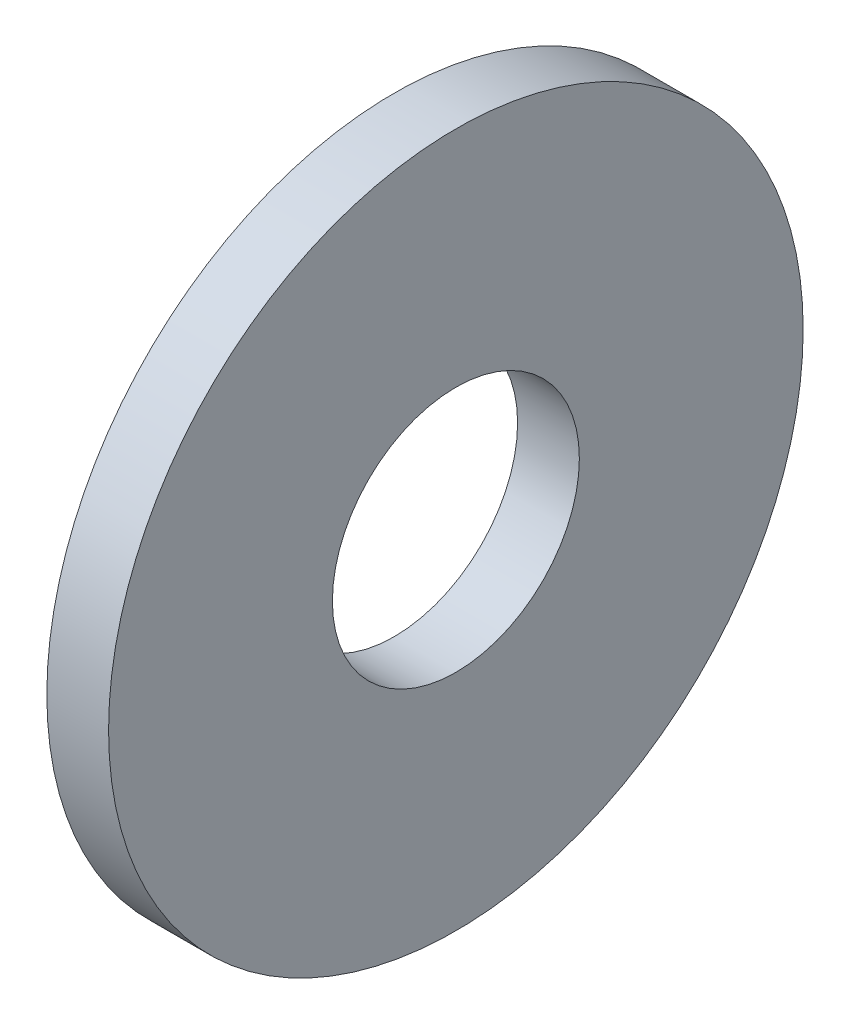
ISO-10303-21;
HEADER;
FILE_DESCRIPTION(('STEP AP214'),'2;1');
FILE_NAME('part.step','',(''),(''),'','','');
FILE_SCHEMA(('AUTOMOTIVE_DESIGN { 1 0 10303 214 1 1 1 1 }'));
ENDSEC;
DATA;
#1=APPLICATION_CONTEXT('core data for automotive mechanical design processes');
#2=APPLICATION_PROTOCOL_DEFINITION('international standard','automotive_design',2000,#1);
#3=PRODUCT_CONTEXT('',#1,'mechanical');
#4=PRODUCT('Part','Part','',(#3));
#5=PRODUCT_RELATED_PRODUCT_CATEGORY('part','',(#4));
#6=PRODUCT_DEFINITION_FORMATION('','',#4);
#7=PRODUCT_DEFINITION_CONTEXT('part definition',#1,'design');
#8=PRODUCT_DEFINITION('design','',#6,#7);
#9=PRODUCT_DEFINITION_SHAPE('','',#8);
#10=(LENGTH_UNIT() NAMED_UNIT(*) SI_UNIT(.MILLI.,.METRE.));
#11=(NAMED_UNIT(*) PLANE_ANGLE_UNIT() SI_UNIT($,.RADIAN.));
#12=(NAMED_UNIT(*) SI_UNIT($,.STERADIAN.) SOLID_ANGLE_UNIT());
#13=UNCERTAINTY_MEASURE_WITH_UNIT(LENGTH_MEASURE(1.E-05),#10,'distance_accuracy_value','');
#14=(GEOMETRIC_REPRESENTATION_CONTEXT(3) GLOBAL_UNCERTAINTY_ASSIGNED_CONTEXT((#13)) GLOBAL_UNIT_ASSIGNED_CONTEXT((#10,
#11,#12)) REPRESENTATION_CONTEXT('',''));
#15=CARTESIAN_POINT('',(0.,0.,0.));
#16=DIRECTION('',(0.,0.,1.));
#17=DIRECTION('',(1.,0.,0.));
#18=AXIS2_PLACEMENT_3D('',#15,#16,#17);
#19=CARTESIAN_POINT('',(-34.9249999999999,0.,0.));
#20=DIRECTION('',(-1.,0.,0.));
#21=DIRECTION('',(0.,0.,1.));
#22=AXIS2_PLACEMENT_3D('',#19,#20,#21);
#23=CYLINDRICAL_SURFACE('',#22,3.2);
#24=CARTESIAN_POINT('',(0.,0.,0.));
#25=DIRECTION('',(-1.,0.,0.));
#26=DIRECTION('',(0.,0.,1.));
#27=AXIS2_PLACEMENT_3D('',#24,#25,#26);
#28=CIRCLE('',#27,3.2);
#29=CARTESIAN_POINT('',(0.,0.,3.2));
#30=VERTEX_POINT('',#29);
#31=EDGE_CURVE('E10',#30,#30,#28,.T.);
#32=ORIENTED_EDGE('',*,*,#31,.F.);
#33=EDGE_LOOP('',(#32));
#34=FACE_BOUND('',#33,.T.);
#35=CARTESIAN_POINT('',(-1.6,0.,0.));
#36=DIRECTION('',(-1.,0.,0.));
#37=DIRECTION('',(0.,0.,1.));
#38=AXIS2_PLACEMENT_3D('',#35,#36,#37);
#39=CIRCLE('',#38,3.2);
#40=CARTESIAN_POINT('',(-1.6,0.,3.2));
#41=VERTEX_POINT('',#40);
#42=EDGE_CURVE('E45',#41,#41,#39,.T.);
#43=ORIENTED_EDGE('',*,*,#42,.T.);
#44=EDGE_LOOP('',(#43));
#45=FACE_BOUND('',#44,.T.);
#46=ADVANCED_FACE('F31',(#34,#45),#23,.F.);
#47=CARTESIAN_POINT('',(0.,3.2,0.));
#48=DIRECTION('',(-1.,0.,0.));
#49=DIRECTION('',(0.,0.,1.));
#50=AXIS2_PLACEMENT_3D('',#47,#48,#49);
#51=PLANE('',#50);
#52=CARTESIAN_POINT('',(0.,0.,0.));
#53=DIRECTION('',(-1.,0.,0.));
#54=DIRECTION('',(0.,0.,1.));
#55=AXIS2_PLACEMENT_3D('',#52,#53,#54);
#56=CIRCLE('',#55,9.);
#57=CARTESIAN_POINT('',(0.,0.,9.));
#58=VERTEX_POINT('',#57);
#59=EDGE_CURVE('E37',#58,#58,#56,.T.);
#60=ORIENTED_EDGE('',*,*,#59,.F.);
#61=EDGE_LOOP('',(#60));
#62=FACE_BOUND('',#61,.T.);
#63=ORIENTED_EDGE('',*,*,#31,.T.);
#64=EDGE_LOOP('',(#63));
#65=FACE_BOUND('',#64,.T.);
#66=ADVANCED_FACE('F60',(#62,#65),#51,.F.);
#67=CARTESIAN_POINT('',(-34.9249999999999,0.,0.));
#68=DIRECTION('',(-1.,0.,0.));
#69=DIRECTION('',(0.,0.,1.));
#70=AXIS2_PLACEMENT_3D('',#67,#68,#69);
#71=CYLINDRICAL_SURFACE('',#70,9.);
#72=CARTESIAN_POINT('',(-1.6,0.,0.));
#73=DIRECTION('',(-1.,0.,0.));
#74=DIRECTION('',(0.,0.,1.));
#75=AXIS2_PLACEMENT_3D('',#72,#73,#74);
#76=CIRCLE('',#75,9.);
#77=CARTESIAN_POINT('',(-1.6,0.,9.));
#78=VERTEX_POINT('',#77);
#79=EDGE_CURVE('E41',#78,#78,#76,.T.);
#80=ORIENTED_EDGE('',*,*,#79,.F.);
#81=EDGE_LOOP('',(#80));
#82=FACE_BOUND('',#81,.T.);
#83=ORIENTED_EDGE('',*,*,#59,.T.);
#84=EDGE_LOOP('',(#83));
#85=FACE_BOUND('',#84,.T.);
#86=ADVANCED_FACE('F55',(#82,#85),#71,.T.);
#87=CARTESIAN_POINT('',(-1.6,9.,0.));
#88=DIRECTION('',(1.,0.,0.));
#89=DIRECTION('',(0.,0.,-1.));
#90=AXIS2_PLACEMENT_3D('',#87,#88,#89);
#91=PLANE('',#90);
#92=ORIENTED_EDGE('',*,*,#42,.F.);
#93=EDGE_LOOP('',(#92));
#94=FACE_BOUND('',#93,.T.);
#95=ORIENTED_EDGE('',*,*,#79,.T.);
#96=EDGE_LOOP('',(#95));
#97=FACE_BOUND('',#96,.T.);
#98=ADVANCED_FACE('F52',(#94,#97),#91,.F.);
#99=CLOSED_SHELL('',(#46,#66,#86,#98));
#100=MANIFOLD_SOLID_BREP('B2',#99);
#101=ADVANCED_BREP_SHAPE_REPRESENTATION('',(#18,#100),#14);
#102=SHAPE_DEFINITION_REPRESENTATION(#9,#101);
ENDSEC;
END-ISO-10303-21;
